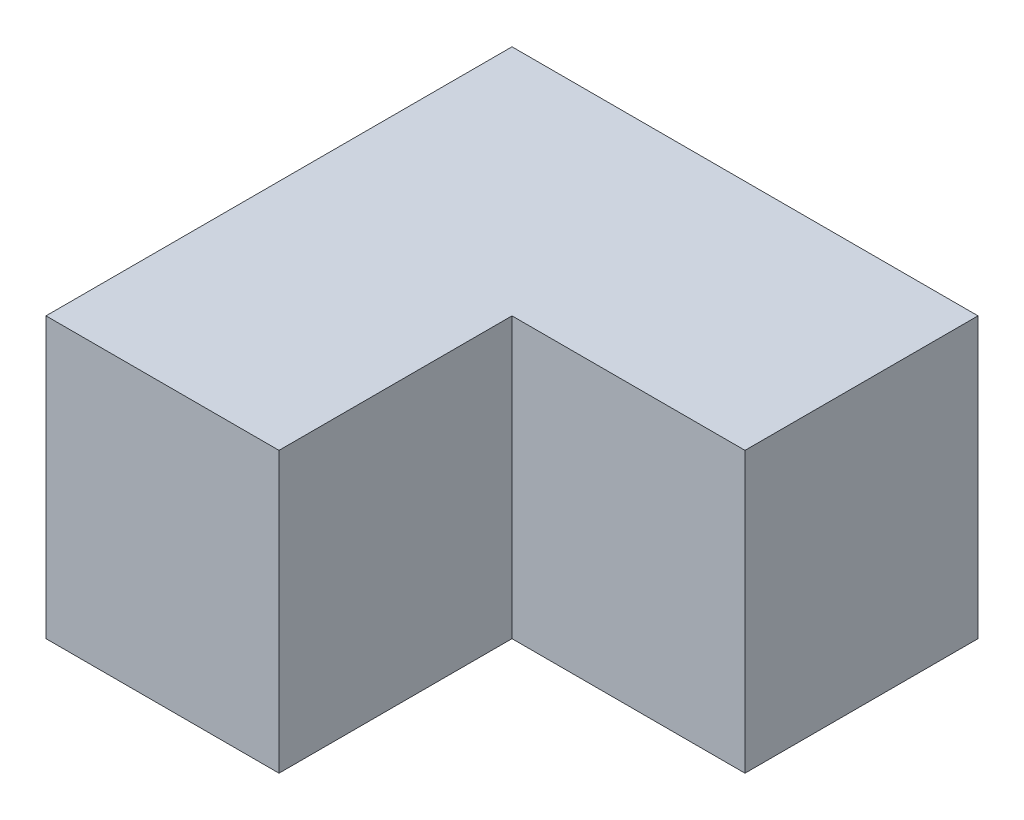
ISO-10303-21;
HEADER;
FILE_DESCRIPTION(('STEP AP214'),'2;1');
FILE_NAME('part.step','',(''),(''),'','','');
FILE_SCHEMA(('AUTOMOTIVE_DESIGN { 1 0 10303 214 1 1 1 1 }'));
ENDSEC;
DATA;
#1=APPLICATION_CONTEXT('core data for automotive mechanical design processes');
#2=APPLICATION_PROTOCOL_DEFINITION('international standard','automotive_design',2000,#1);
#3=PRODUCT_CONTEXT('',#1,'mechanical');
#4=PRODUCT('Part','Part','',(#3));
#5=PRODUCT_RELATED_PRODUCT_CATEGORY('part','',(#4));
#6=PRODUCT_DEFINITION_FORMATION('','',#4);
#7=PRODUCT_DEFINITION_CONTEXT('part definition',#1,'design');
#8=PRODUCT_DEFINITION('design','',#6,#7);
#9=PRODUCT_DEFINITION_SHAPE('','',#8);
#10=(LENGTH_UNIT() NAMED_UNIT(*) SI_UNIT(.MILLI.,.METRE.));
#11=(NAMED_UNIT(*) PLANE_ANGLE_UNIT() SI_UNIT($,.RADIAN.));
#12=(NAMED_UNIT(*) SI_UNIT($,.STERADIAN.) SOLID_ANGLE_UNIT());
#13=UNCERTAINTY_MEASURE_WITH_UNIT(LENGTH_MEASURE(1.E-05),#10,'distance_accuracy_value','');
#14=(GEOMETRIC_REPRESENTATION_CONTEXT(3) GLOBAL_UNCERTAINTY_ASSIGNED_CONTEXT((#13)) GLOBAL_UNIT_ASSIGNED_CONTEXT((#10,
#11,#12)) REPRESENTATION_CONTEXT('',''));
#15=CARTESIAN_POINT('',(0.,0.,0.));
#16=DIRECTION('',(0.,0.,1.));
#17=DIRECTION('',(1.,0.,0.));
#18=AXIS2_PLACEMENT_3D('',#15,#16,#17);
#19=CARTESIAN_POINT('',(15.,18.,15.));
#20=DIRECTION('',(-1.,0.,0.));
#21=DIRECTION('',(0.,0.,1.));
#22=AXIS2_PLACEMENT_3D('',#19,#20,#21);
#23=PLANE('',#22);
#24=DIRECTION('',(0.,0.,-1.));
#25=VECTOR('',#24,1.);
#26=CARTESIAN_POINT('',(15.,18.,15.));
#27=LINE('',#26,#25);
#28=CARTESIAN_POINT('',(15.,18.,0.));
#29=VERTEX_POINT('',#28);
#30=CARTESIAN_POINT('',(15.,18.,-15.));
#31=VERTEX_POINT('',#30);
#32=EDGE_CURVE('E82',#29,#31,#27,.T.);
#33=ORIENTED_EDGE('',*,*,#32,.F.);
#34=DIRECTION('',(0.,1.,0.));
#35=VECTOR('',#34,1.);
#36=CARTESIAN_POINT('',(15.,0.,0.));
#37=LINE('',#36,#35);
#38=CARTESIAN_POINT('',(15.,0.,0.));
#39=VERTEX_POINT('',#38);
#40=EDGE_CURVE('E102',#39,#29,#37,.T.);
#41=ORIENTED_EDGE('',*,*,#40,.F.);
#42=DIRECTION('',(0.,0.,-1.));
#43=VECTOR('',#42,1.);
#44=CARTESIAN_POINT('',(15.,0.,15.));
#45=LINE('',#44,#43);
#46=CARTESIAN_POINT('',(15.,0.,-15.));
#47=VERTEX_POINT('',#46);
#48=EDGE_CURVE('E110',#39,#47,#45,.T.);
#49=ORIENTED_EDGE('',*,*,#48,.T.);
#50=DIRECTION('',(0.,-1.,0.));
#51=VECTOR('',#50,1.);
#52=CARTESIAN_POINT('',(15.,18.,-15.));
#53=LINE('',#52,#51);
#54=EDGE_CURVE('E11',#31,#47,#53,.T.);
#55=ORIENTED_EDGE('',*,*,#54,.F.);
#56=EDGE_LOOP('',(#33,#41,#49,#55));
#57=FACE_BOUND('',#56,.T.);
#58=ADVANCED_FACE('F37',(#57),#23,.F.);
#59=CARTESIAN_POINT('',(-15.,18.,-15.));
#60=DIRECTION('',(0.,0.,1.));
#61=DIRECTION('',(1.,0.,0.));
#62=AXIS2_PLACEMENT_3D('',#59,#60,#61);
#63=PLANE('',#62);
#64=DIRECTION('',(-1.,0.,0.));
#65=VECTOR('',#64,1.);
#66=CARTESIAN_POINT('',(-15.,0.,-15.));
#67=LINE('',#66,#65);
#68=CARTESIAN_POINT('',(-15.,0.,-15.));
#69=VERTEX_POINT('',#68);
#70=EDGE_CURVE('E114',#47,#69,#67,.T.);
#71=ORIENTED_EDGE('',*,*,#70,.T.);
#72=DIRECTION('',(0.,-1.,0.));
#73=VECTOR('',#72,1.);
#74=CARTESIAN_POINT('',(-15.,18.,-15.));
#75=LINE('',#74,#73);
#76=CARTESIAN_POINT('',(-15.,18.,-15.));
#77=VERTEX_POINT('',#76);
#78=EDGE_CURVE('E44',#77,#69,#75,.T.);
#79=ORIENTED_EDGE('',*,*,#78,.F.);
#80=DIRECTION('',(-1.,0.,0.));
#81=VECTOR('',#80,1.);
#82=CARTESIAN_POINT('',(-15.,18.,-15.));
#83=LINE('',#82,#81);
#84=EDGE_CURVE('E137',#31,#77,#83,.T.);
#85=ORIENTED_EDGE('',*,*,#84,.F.);
#86=ORIENTED_EDGE('',*,*,#54,.T.);
#87=EDGE_LOOP('',(#71,#79,#85,#86));
#88=FACE_BOUND('',#87,.T.);
#89=ADVANCED_FACE('F156',(#88),#63,.F.);
#90=CARTESIAN_POINT('',(-15.,18.,15.));
#91=DIRECTION('',(1.,0.,0.));
#92=DIRECTION('',(0.,0.,-1.));
#93=AXIS2_PLACEMENT_3D('',#90,#91,#92);
#94=PLANE('',#93);
#95=DIRECTION('',(0.,0.,1.));
#96=VECTOR('',#95,1.);
#97=CARTESIAN_POINT('',(-15.,0.,15.));
#98=LINE('',#97,#96);
#99=CARTESIAN_POINT('',(-15.,0.,15.));
#100=VERTEX_POINT('',#99);
#101=EDGE_CURVE('E77',#69,#100,#98,.T.);
#102=ORIENTED_EDGE('',*,*,#101,.T.);
#103=DIRECTION('',(0.,-1.,0.));
#104=VECTOR('',#103,1.);
#105=CARTESIAN_POINT('',(-15.,18.,15.));
#106=LINE('',#105,#104);
#107=CARTESIAN_POINT('',(-15.,18.,15.));
#108=VERTEX_POINT('',#107);
#109=EDGE_CURVE('E128',#108,#100,#106,.T.);
#110=ORIENTED_EDGE('',*,*,#109,.F.);
#111=DIRECTION('',(0.,0.,1.));
#112=VECTOR('',#111,1.);
#113=CARTESIAN_POINT('',(-15.,18.,15.));
#114=LINE('',#113,#112);
#115=EDGE_CURVE('E60',#77,#108,#114,.T.);
#116=ORIENTED_EDGE('',*,*,#115,.F.);
#117=ORIENTED_EDGE('',*,*,#78,.T.);
#118=EDGE_LOOP('',(#102,#110,#116,#117));
#119=FACE_BOUND('',#118,.T.);
#120=ADVANCED_FACE('F130',(#119),#94,.F.);
#121=CARTESIAN_POINT('',(-15.,18.,15.));
#122=DIRECTION('',(0.,0.,-1.));
#123=DIRECTION('',(-1.,0.,0.));
#124=AXIS2_PLACEMENT_3D('',#121,#122,#123);
#125=PLANE('',#124);
#126=DIRECTION('',(1.,0.,0.));
#127=VECTOR('',#126,1.);
#128=CARTESIAN_POINT('',(-15.,0.,15.));
#129=LINE('',#128,#127);
#130=CARTESIAN_POINT('',(0.,0.,15.));
#131=VERTEX_POINT('',#130);
#132=EDGE_CURVE('E125',#100,#131,#129,.T.);
#133=ORIENTED_EDGE('',*,*,#132,.T.);
#134=DIRECTION('',(0.,1.,0.));
#135=VECTOR('',#134,1.);
#136=CARTESIAN_POINT('',(0.,0.,15.));
#137=LINE('',#136,#135);
#138=CARTESIAN_POINT('',(0.,18.,15.));
#139=VERTEX_POINT('',#138);
#140=EDGE_CURVE('E115',#131,#139,#137,.T.);
#141=ORIENTED_EDGE('',*,*,#140,.T.);
#142=DIRECTION('',(1.,0.,0.));
#143=VECTOR('',#142,1.);
#144=CARTESIAN_POINT('',(-15.,18.,15.));
#145=LINE('',#144,#143);
#146=EDGE_CURVE('E121',#108,#139,#145,.T.);
#147=ORIENTED_EDGE('',*,*,#146,.F.);
#148=ORIENTED_EDGE('',*,*,#109,.T.);
#149=EDGE_LOOP('',(#133,#141,#147,#148));
#150=FACE_BOUND('',#149,.T.);
#151=ADVANCED_FACE('F134',(#150),#125,.F.);
#152=CARTESIAN_POINT('',(0.,18.,0.));
#153=DIRECTION('',(0.,-1.,0.));
#154=DIRECTION('',(0.,0.,-1.));
#155=AXIS2_PLACEMENT_3D('',#152,#153,#154);
#156=PLANE('',#155);
#157=ORIENTED_EDGE('',*,*,#146,.T.);
#158=DIRECTION('',(0.,0.,1.));
#159=VECTOR('',#158,1.);
#160=CARTESIAN_POINT('',(0.,18.,15.));
#161=LINE('',#160,#159);
#162=CARTESIAN_POINT('',(0.,18.,0.));
#163=VERTEX_POINT('',#162);
#164=EDGE_CURVE('E106',#163,#139,#161,.T.);
#165=ORIENTED_EDGE('',*,*,#164,.F.);
#166=DIRECTION('',(-1.,0.,0.));
#167=VECTOR('',#166,1.);
#168=CARTESIAN_POINT('',(15.,18.,0.));
#169=LINE('',#168,#167);
#170=EDGE_CURVE('E143',#29,#163,#169,.T.);
#171=ORIENTED_EDGE('',*,*,#170,.F.);
#172=ORIENTED_EDGE('',*,*,#32,.T.);
#173=ORIENTED_EDGE('',*,*,#84,.T.);
#174=ORIENTED_EDGE('',*,*,#115,.T.);
#175=EDGE_LOOP('',(#157,#165,#171,#172,#173,#174));
#176=FACE_BOUND('',#175,.T.);
#177=ADVANCED_FACE('F145',(#176),#156,.F.);
#178=CARTESIAN_POINT('',(0.,0.,0.));
#179=DIRECTION('',(0.,-1.,0.));
#180=DIRECTION('',(0.,0.,-1.));
#181=AXIS2_PLACEMENT_3D('',#178,#179,#180);
#182=PLANE('',#181);
#183=DIRECTION('',(0.,0.,1.));
#184=VECTOR('',#183,1.);
#185=CARTESIAN_POINT('',(0.,0.,15.));
#186=LINE('',#185,#184);
#187=CARTESIAN_POINT('',(0.,0.,0.));
#188=VERTEX_POINT('',#187);
#189=EDGE_CURVE('E51',#188,#131,#186,.T.);
#190=ORIENTED_EDGE('',*,*,#189,.T.);
#191=ORIENTED_EDGE('',*,*,#132,.F.);
#192=ORIENTED_EDGE('',*,*,#101,.F.);
#193=ORIENTED_EDGE('',*,*,#70,.F.);
#194=ORIENTED_EDGE('',*,*,#48,.F.);
#195=DIRECTION('',(-1.,0.,0.));
#196=VECTOR('',#195,1.);
#197=CARTESIAN_POINT('',(15.,0.,0.));
#198=LINE('',#197,#196);
#199=EDGE_CURVE('E98',#39,#188,#198,.T.);
#200=ORIENTED_EDGE('',*,*,#199,.T.);
#201=EDGE_LOOP('',(#190,#191,#192,#193,#194,#200));
#202=FACE_BOUND('',#201,.T.);
#203=ADVANCED_FACE('F113',(#202),#182,.T.);
#204=CARTESIAN_POINT('',(0.,0.,15.));
#205=DIRECTION('',(-1.,0.,0.));
#206=DIRECTION('',(0.,0.,1.));
#207=AXIS2_PLACEMENT_3D('',#204,#205,#206);
#208=PLANE('',#207);
#209=ORIENTED_EDGE('',*,*,#164,.T.);
#210=ORIENTED_EDGE('',*,*,#140,.F.);
#211=ORIENTED_EDGE('',*,*,#189,.F.);
#212=DIRECTION('',(0.,1.,0.));
#213=VECTOR('',#212,1.);
#214=CARTESIAN_POINT('',(0.,0.,0.));
#215=LINE('',#214,#213);
#216=EDGE_CURVE('E103',#188,#163,#215,.T.);
#217=ORIENTED_EDGE('',*,*,#216,.T.);
#218=EDGE_LOOP('',(#209,#210,#211,#217));
#219=FACE_BOUND('',#218,.T.);
#220=ADVANCED_FACE('F146',(#219),#208,.F.);
#221=CARTESIAN_POINT('',(15.,0.,0.));
#222=DIRECTION('',(0.,0.,-1.));
#223=DIRECTION('',(-1.,0.,0.));
#224=AXIS2_PLACEMENT_3D('',#221,#222,#223);
#225=PLANE('',#224);
#226=ORIENTED_EDGE('',*,*,#170,.T.);
#227=ORIENTED_EDGE('',*,*,#216,.F.);
#228=ORIENTED_EDGE('',*,*,#199,.F.);
#229=ORIENTED_EDGE('',*,*,#40,.T.);
#230=EDGE_LOOP('',(#226,#227,#228,#229));
#231=FACE_BOUND('',#230,.T.);
#232=ADVANCED_FACE('F101',(#231),#225,.F.);
#233=CLOSED_SHELL('',(#58,#89,#120,#151,#177,#203,#220,#232));
#234=MANIFOLD_SOLID_BREP('B2',#233);
#235=ADVANCED_BREP_SHAPE_REPRESENTATION('',(#18,#234),#14);
#236=SHAPE_DEFINITION_REPRESENTATION(#9,#235);
ENDSEC;
END-ISO-10303-21;
